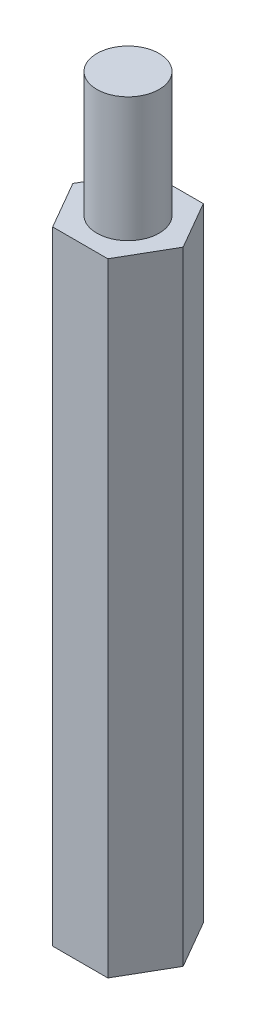
ISO-10303-21;
HEADER;
FILE_DESCRIPTION(('STEP AP214'),'2;1');
FILE_NAME('part.step','',(''),(''),'','','');
FILE_SCHEMA(('AUTOMOTIVE_DESIGN { 1 0 10303 214 1 1 1 1 }'));
ENDSEC;
DATA;
#1=APPLICATION_CONTEXT('core data for automotive mechanical design processes');
#2=APPLICATION_PROTOCOL_DEFINITION('international standard','automotive_design',2000,#1);
#3=PRODUCT_CONTEXT('',#1,'mechanical');
#4=PRODUCT('Part','Part','',(#3));
#5=PRODUCT_RELATED_PRODUCT_CATEGORY('part','',(#4));
#6=PRODUCT_DEFINITION_FORMATION('','',#4);
#7=PRODUCT_DEFINITION_CONTEXT('part definition',#1,'design');
#8=PRODUCT_DEFINITION('design','',#6,#7);
#9=PRODUCT_DEFINITION_SHAPE('','',#8);
#10=(LENGTH_UNIT() NAMED_UNIT(*) SI_UNIT(.MILLI.,.METRE.));
#11=(NAMED_UNIT(*) PLANE_ANGLE_UNIT() SI_UNIT($,.RADIAN.));
#12=(NAMED_UNIT(*) SI_UNIT($,.STERADIAN.) SOLID_ANGLE_UNIT());
#13=UNCERTAINTY_MEASURE_WITH_UNIT(LENGTH_MEASURE(1.E-05),#10,'distance_accuracy_value','');
#14=(GEOMETRIC_REPRESENTATION_CONTEXT(3) GLOBAL_UNCERTAINTY_ASSIGNED_CONTEXT((#13)) GLOBAL_UNIT_ASSIGNED_CONTEXT((#10,
#11,#12)) REPRESENTATION_CONTEXT('',''));
#15=CARTESIAN_POINT('',(0.,0.,0.));
#16=DIRECTION('',(0.,0.,1.));
#17=DIRECTION('',(1.,0.,0.));
#18=AXIS2_PLACEMENT_3D('',#15,#16,#17);
#19=CARTESIAN_POINT('',(1.32790561913617,30.,2.29999999999999));
#20=DIRECTION('',(-0.866025403784442,0.,-0.499999999999995));
#21=DIRECTION('',(-0.499999999999995,0.,0.866025403784442));
#22=AXIS2_PLACEMENT_3D('',#19,#20,#21);
#23=PLANE('',#22);
#24=DIRECTION('',(0.499999999999995,0.,-0.866025403784442));
#25=VECTOR('',#24,1.);
#26=CARTESIAN_POINT('',(1.32790561913617,0.,2.29999999999999));
#27=LINE('',#26,#25);
#28=CARTESIAN_POINT('',(1.32790561913617,0.,2.29999999999999));
#29=VERTEX_POINT('',#28);
#30=CARTESIAN_POINT('',(2.65581123827228,0.,0.));
#31=VERTEX_POINT('',#30);
#32=EDGE_CURVE('E126',#29,#31,#27,.T.);
#33=ORIENTED_EDGE('',*,*,#32,.T.);
#34=DIRECTION('',(0.,-1.,0.));
#35=VECTOR('',#34,1.);
#36=CARTESIAN_POINT('',(2.65581123827228,30.,0.));
#37=LINE('',#36,#35);
#38=CARTESIAN_POINT('',(2.65581123827228,30.,0.));
#39=VERTEX_POINT('',#38);
#40=EDGE_CURVE('E44',#39,#31,#37,.T.);
#41=ORIENTED_EDGE('',*,*,#40,.F.);
#42=DIRECTION('',(0.499999999999995,0.,-0.866025403784442));
#43=VECTOR('',#42,1.);
#44=CARTESIAN_POINT('',(1.32790561913617,30.,2.29999999999999));
#45=LINE('',#44,#43);
#46=CARTESIAN_POINT('',(1.32790561913617,30.,2.29999999999999));
#47=VERTEX_POINT('',#46);
#48=EDGE_CURVE('E138',#47,#39,#45,.T.);
#49=ORIENTED_EDGE('',*,*,#48,.F.);
#50=DIRECTION('',(0.,-1.,0.));
#51=VECTOR('',#50,1.);
#52=CARTESIAN_POINT('',(1.32790561913617,30.,2.29999999999999));
#53=LINE('',#52,#51);
#54=EDGE_CURVE('E123',#47,#29,#53,.T.);
#55=ORIENTED_EDGE('',*,*,#54,.T.);
#56=EDGE_LOOP('',(#33,#41,#49,#55));
#57=FACE_BOUND('',#56,.T.);
#58=ADVANCED_FACE('F45',(#57),#23,.F.);
#59=CARTESIAN_POINT('',(2.65581123827228,30.,0.));
#60=DIRECTION('',(-0.866025403784438,0.,0.500000000000001));
#61=DIRECTION('',(0.500000000000001,0.,0.866025403784438));
#62=AXIS2_PLACEMENT_3D('',#59,#60,#61);
#63=PLANE('',#62);
#64=DIRECTION('',(-0.500000000000001,0.,-0.866025403784438));
#65=VECTOR('',#64,1.);
#66=CARTESIAN_POINT('',(2.65581123827228,0.,0.));
#67=LINE('',#66,#65);
#68=CARTESIAN_POINT('',(1.32790561913613,0.,-2.3));
#69=VERTEX_POINT('',#68);
#70=EDGE_CURVE('E131',#31,#69,#67,.T.);
#71=ORIENTED_EDGE('',*,*,#70,.T.);
#72=DIRECTION('',(0.,-1.,0.));
#73=VECTOR('',#72,1.);
#74=CARTESIAN_POINT('',(1.32790561913613,30.,-2.3));
#75=LINE('',#74,#73);
#76=CARTESIAN_POINT('',(1.32790561913613,30.,-2.3));
#77=VERTEX_POINT('',#76);
#78=EDGE_CURVE('E142',#77,#69,#75,.T.);
#79=ORIENTED_EDGE('',*,*,#78,.F.);
#80=DIRECTION('',(-0.500000000000001,0.,-0.866025403784438));
#81=VECTOR('',#80,1.);
#82=CARTESIAN_POINT('',(2.65581123827228,30.,0.));
#83=LINE('',#82,#81);
#84=EDGE_CURVE('E100',#39,#77,#83,.T.);
#85=ORIENTED_EDGE('',*,*,#84,.F.);
#86=ORIENTED_EDGE('',*,*,#40,.T.);
#87=EDGE_LOOP('',(#71,#79,#85,#86));
#88=FACE_BOUND('',#87,.T.);
#89=ADVANCED_FACE('F150',(#88),#63,.F.);
#90=CARTESIAN_POINT('',(1.32790561913613,30.,-2.3));
#91=DIRECTION('',(0.,0.,1.));
#92=DIRECTION('',(1.,0.,0.));
#93=AXIS2_PLACEMENT_3D('',#90,#91,#92);
#94=PLANE('',#93);
#95=DIRECTION('',(-1.,0.,0.));
#96=VECTOR('',#95,1.);
#97=CARTESIAN_POINT('',(1.32790561913613,0.,-2.3));
#98=LINE('',#97,#96);
#99=CARTESIAN_POINT('',(-1.32790561913615,0.,-2.3));
#100=VERTEX_POINT('',#99);
#101=EDGE_CURVE('E133',#69,#100,#98,.T.);
#102=ORIENTED_EDGE('',*,*,#101,.T.);
#103=DIRECTION('',(0.,-1.,0.));
#104=VECTOR('',#103,1.);
#105=CARTESIAN_POINT('',(-1.32790561913615,30.,-2.3));
#106=LINE('',#105,#104);
#107=CARTESIAN_POINT('',(-1.32790561913615,30.,-2.3));
#108=VERTEX_POINT('',#107);
#109=EDGE_CURVE('E118',#108,#100,#106,.T.);
#110=ORIENTED_EDGE('',*,*,#109,.F.);
#111=DIRECTION('',(-1.,0.,0.));
#112=VECTOR('',#111,1.);
#113=CARTESIAN_POINT('',(1.32790561913613,30.,-2.3));
#114=LINE('',#113,#112);
#115=EDGE_CURVE('E109',#77,#108,#114,.T.);
#116=ORIENTED_EDGE('',*,*,#115,.F.);
#117=ORIENTED_EDGE('',*,*,#78,.T.);
#118=EDGE_LOOP('',(#102,#110,#116,#117));
#119=FACE_BOUND('',#118,.T.);
#120=ADVANCED_FACE('F153',(#119),#94,.F.);
#121=CARTESIAN_POINT('',(-1.32790561913615,30.,-2.3));
#122=DIRECTION('',(0.866025403784441,0.,0.499999999999995));
#123=DIRECTION('',(0.499999999999995,0.,-0.866025403784442));
#124=AXIS2_PLACEMENT_3D('',#121,#122,#123);
#125=PLANE('',#124);
#126=DIRECTION('',(-0.499999999999995,0.,0.866025403784442));
#127=VECTOR('',#126,1.);
#128=CARTESIAN_POINT('',(-1.32790561913615,0.,-2.3));
#129=LINE('',#128,#127);
#130=CARTESIAN_POINT('',(-2.65581123827228,0.,0.));
#131=VERTEX_POINT('',#130);
#132=EDGE_CURVE('E119',#100,#131,#129,.T.);
#133=ORIENTED_EDGE('',*,*,#132,.T.);
#134=DIRECTION('',(0.,-1.,0.));
#135=VECTOR('',#134,1.);
#136=CARTESIAN_POINT('',(-2.65581123827228,30.,0.));
#137=LINE('',#136,#135);
#138=CARTESIAN_POINT('',(-2.65581123827228,30.,0.));
#139=VERTEX_POINT('',#138);
#140=EDGE_CURVE('E113',#139,#131,#137,.T.);
#141=ORIENTED_EDGE('',*,*,#140,.F.);
#142=DIRECTION('',(-0.499999999999995,0.,0.866025403784442));
#143=VECTOR('',#142,1.);
#144=CARTESIAN_POINT('',(-1.32790561913615,30.,-2.3));
#145=LINE('',#144,#143);
#146=EDGE_CURVE('E102',#108,#139,#145,.T.);
#147=ORIENTED_EDGE('',*,*,#146,.F.);
#148=ORIENTED_EDGE('',*,*,#109,.T.);
#149=EDGE_LOOP('',(#133,#141,#147,#148));
#150=FACE_BOUND('',#149,.T.);
#151=ADVANCED_FACE('F116',(#150),#125,.F.);
#152=CARTESIAN_POINT('',(-2.65581123827228,30.,0.));
#153=DIRECTION('',(0.866025403784435,0.,-0.500000000000007));
#154=DIRECTION('',(-0.500000000000007,0.,-0.866025403784435));
#155=AXIS2_PLACEMENT_3D('',#152,#153,#154);
#156=PLANE('',#155);
#157=DIRECTION('',(0.500000000000007,0.,0.866025403784435));
#158=VECTOR('',#157,1.);
#159=CARTESIAN_POINT('',(-2.65581123827228,0.,0.));
#160=LINE('',#159,#158);
#161=CARTESIAN_POINT('',(-1.32790561913612,0.,2.30000000000001));
#162=VERTEX_POINT('',#161);
#163=EDGE_CURVE('E81',#131,#162,#160,.T.);
#164=ORIENTED_EDGE('',*,*,#163,.T.);
#165=DIRECTION('',(0.,-1.,0.));
#166=VECTOR('',#165,1.);
#167=CARTESIAN_POINT('',(-1.32790561913612,30.,2.30000000000001));
#168=LINE('',#167,#166);
#169=CARTESIAN_POINT('',(-1.32790561913612,30.,2.30000000000001));
#170=VERTEX_POINT('',#169);
#171=EDGE_CURVE('E120',#170,#162,#168,.T.);
#172=ORIENTED_EDGE('',*,*,#171,.F.);
#173=DIRECTION('',(0.500000000000007,0.,0.866025403784435));
#174=VECTOR('',#173,1.);
#175=CARTESIAN_POINT('',(-2.65581123827228,30.,0.));
#176=LINE('',#175,#174);
#177=EDGE_CURVE('E107',#139,#170,#176,.T.);
#178=ORIENTED_EDGE('',*,*,#177,.F.);
#179=ORIENTED_EDGE('',*,*,#140,.T.);
#180=EDGE_LOOP('',(#164,#172,#178,#179));
#181=FACE_BOUND('',#180,.T.);
#182=ADVANCED_FACE('F125',(#181),#156,.F.);
#183=CARTESIAN_POINT('',(-1.32790561913612,30.,2.30000000000001));
#184=DIRECTION('',(0.,0.,-1.));
#185=DIRECTION('',(-1.,0.,0.));
#186=AXIS2_PLACEMENT_3D('',#183,#184,#185);
#187=PLANE('',#186);
#188=DIRECTION('',(1.,0.,0.));
#189=VECTOR('',#188,1.);
#190=CARTESIAN_POINT('',(-1.32790561913612,0.,2.30000000000001));
#191=LINE('',#190,#189);
#192=EDGE_CURVE('E86',#162,#29,#191,.T.);
#193=ORIENTED_EDGE('',*,*,#192,.T.);
#194=ORIENTED_EDGE('',*,*,#54,.F.);
#195=DIRECTION('',(1.,0.,0.));
#196=VECTOR('',#195,1.);
#197=CARTESIAN_POINT('',(-1.32790561913612,30.,2.30000000000001));
#198=LINE('',#197,#196);
#199=EDGE_CURVE('E56',#170,#47,#198,.T.);
#200=ORIENTED_EDGE('',*,*,#199,.F.);
#201=ORIENTED_EDGE('',*,*,#171,.T.);
#202=EDGE_LOOP('',(#193,#194,#200,#201));
#203=FACE_BOUND('',#202,.T.);
#204=ADVANCED_FACE('F186',(#203),#187,.F.);
#205=CARTESIAN_POINT('',(0.,30.,0.));
#206=DIRECTION('',(0.,1.,0.));
#207=DIRECTION('',(0.,0.,1.));
#208=AXIS2_PLACEMENT_3D('',#205,#206,#207);
#209=PLANE('',#208);
#210=CARTESIAN_POINT('',(0.,30.,0.));
#211=DIRECTION('',(0.,1.,0.));
#212=DIRECTION('',(0.,0.,1.));
#213=AXIS2_PLACEMENT_3D('',#210,#211,#212);
#214=CIRCLE('',#213,1.5);
#215=CARTESIAN_POINT('',(0.,30.,1.5));
#216=VERTEX_POINT('',#215);
#217=EDGE_CURVE('E11',#216,#216,#214,.T.);
#218=ORIENTED_EDGE('',*,*,#217,.F.);
#219=EDGE_LOOP('',(#218));
#220=FACE_BOUND('',#219,.T.);
#221=ORIENTED_EDGE('',*,*,#48,.T.);
#222=ORIENTED_EDGE('',*,*,#84,.T.);
#223=ORIENTED_EDGE('',*,*,#115,.T.);
#224=ORIENTED_EDGE('',*,*,#146,.T.);
#225=ORIENTED_EDGE('',*,*,#177,.T.);
#226=ORIENTED_EDGE('',*,*,#199,.T.);
#227=EDGE_LOOP('',(#221,#222,#223,#224,#225,#226));
#228=FACE_BOUND('',#227,.T.);
#229=ADVANCED_FACE('F106',(#220,#228),#209,.T.);
#230=CARTESIAN_POINT('',(0.,0.,0.));
#231=DIRECTION('',(0.,1.,0.));
#232=DIRECTION('',(0.,0.,1.));
#233=AXIS2_PLACEMENT_3D('',#230,#231,#232);
#234=PLANE('',#233);
#235=CARTESIAN_POINT('',(0.,0.,0.));
#236=DIRECTION('',(0.,-1.,0.));
#237=DIRECTION('',(0.,0.,-1.));
#238=AXIS2_PLACEMENT_3D('',#235,#236,#237);
#239=CIRCLE('',#238,1.5);
#240=CARTESIAN_POINT('',(0.,0.,-1.5));
#241=VERTEX_POINT('',#240);
#242=EDGE_CURVE('E159',#241,#241,#239,.T.);
#243=ORIENTED_EDGE('',*,*,#242,.F.);
#244=EDGE_LOOP('',(#243));
#245=FACE_BOUND('',#244,.T.);
#246=ORIENTED_EDGE('',*,*,#32,.F.);
#247=ORIENTED_EDGE('',*,*,#192,.F.);
#248=ORIENTED_EDGE('',*,*,#163,.F.);
#249=ORIENTED_EDGE('',*,*,#132,.F.);
#250=ORIENTED_EDGE('',*,*,#101,.F.);
#251=ORIENTED_EDGE('',*,*,#70,.F.);
#252=EDGE_LOOP('',(#246,#247,#248,#249,#250,#251));
#253=FACE_BOUND('',#252,.T.);
#254=ADVANCED_FACE('F155',(#245,#253),#234,.F.);
#255=CARTESIAN_POINT('',(0.,36.,0.));
#256=DIRECTION('',(0.,-1.,0.));
#257=DIRECTION('',(0.,0.,-1.));
#258=AXIS2_PLACEMENT_3D('',#255,#256,#257);
#259=CYLINDRICAL_SURFACE('',#258,1.5);
#260=CARTESIAN_POINT('',(0.,36.,0.));
#261=DIRECTION('',(0.,1.,0.));
#262=DIRECTION('',(0.,0.,1.));
#263=AXIS2_PLACEMENT_3D('',#260,#261,#262);
#264=CIRCLE('',#263,1.5);
#265=CARTESIAN_POINT('',(0.,36.,1.5));
#266=VERTEX_POINT('',#265);
#267=EDGE_CURVE('E132',#266,#266,#264,.T.);
#268=ORIENTED_EDGE('',*,*,#267,.F.);
#269=EDGE_LOOP('',(#268));
#270=FACE_BOUND('',#269,.T.);
#271=ORIENTED_EDGE('',*,*,#217,.T.);
#272=EDGE_LOOP('',(#271));
#273=FACE_BOUND('',#272,.T.);
#274=ADVANCED_FACE('F176',(#270,#273),#259,.T.);
#275=CARTESIAN_POINT('',(0.,36.,0.));
#276=DIRECTION('',(0.,1.,0.));
#277=DIRECTION('',(0.,0.,1.));
#278=AXIS2_PLACEMENT_3D('',#275,#276,#277);
#279=PLANE('',#278);
#280=ORIENTED_EDGE('',*,*,#267,.T.);
#281=EDGE_LOOP('',(#280));
#282=FACE_BOUND('',#281,.T.);
#283=ADVANCED_FACE('F171',(#282),#279,.T.);
#284=CARTESIAN_POINT('',(0.,10.,0.));
#285=DIRECTION('',(0.,-1.,0.));
#286=DIRECTION('',(0.,0.,-1.));
#287=AXIS2_PLACEMENT_3D('',#284,#285,#286);
#288=CYLINDRICAL_SURFACE('',#287,1.5);
#289=CARTESIAN_POINT('',(0.,10.,0.));
#290=DIRECTION('',(0.,-1.,0.));
#291=DIRECTION('',(0.,0.,-1.));
#292=AXIS2_PLACEMENT_3D('',#289,#290,#291);
#293=CIRCLE('',#292,1.5);
#294=CARTESIAN_POINT('',(0.,10.,-1.5));
#295=VERTEX_POINT('',#294);
#296=EDGE_CURVE('E157',#295,#295,#293,.T.);
#297=ORIENTED_EDGE('',*,*,#296,.F.);
#298=EDGE_LOOP('',(#297));
#299=FACE_BOUND('',#298,.T.);
#300=ORIENTED_EDGE('',*,*,#242,.T.);
#301=EDGE_LOOP('',(#300));
#302=FACE_BOUND('',#301,.T.);
#303=ADVANCED_FACE('F169',(#299,#302),#288,.F.);
#304=CARTESIAN_POINT('',(0.,10.,0.));
#305=DIRECTION('',(0.,-1.,0.));
#306=DIRECTION('',(0.,0.,-1.));
#307=AXIS2_PLACEMENT_3D('',#304,#305,#306);
#308=PLANE('',#307);
#309=ORIENTED_EDGE('',*,*,#296,.T.);
#310=EDGE_LOOP('',(#309));
#311=FACE_BOUND('',#310,.T.);
#312=ADVANCED_FACE('F167',(#311),#308,.T.);
#313=CLOSED_SHELL('',(#58,#89,#120,#151,#182,#204,#229,#254,#274,#283,#303,#312));
#314=MANIFOLD_SOLID_BREP('B2',#313);
#315=ADVANCED_BREP_SHAPE_REPRESENTATION('',(#18,#314),#14);
#316=SHAPE_DEFINITION_REPRESENTATION(#9,#315);
ENDSEC;
END-ISO-10303-21;
